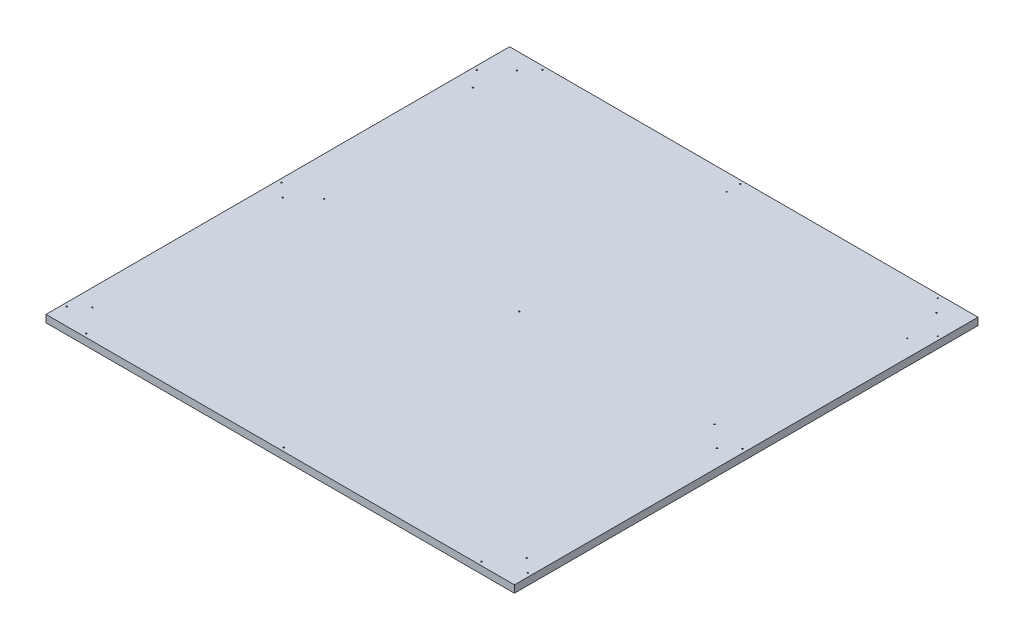
ISO-10303-21;
HEADER;
FILE_DESCRIPTION(('STEP AP214'),'2;1');
FILE_NAME('part.step','',(''),(''),'','','');
FILE_SCHEMA(('AUTOMOTIVE_DESIGN { 1 0 10303 214 1 1 1 1 }'));
ENDSEC;
DATA;
#1=APPLICATION_CONTEXT('core data for automotive mechanical design processes');
#2=APPLICATION_PROTOCOL_DEFINITION('international standard','automotive_design',2000,#1);
#3=PRODUCT_CONTEXT('',#1,'mechanical');
#4=PRODUCT('Part','Part','',(#3));
#5=PRODUCT_RELATED_PRODUCT_CATEGORY('part','',(#4));
#6=PRODUCT_DEFINITION_FORMATION('','',#4);
#7=PRODUCT_DEFINITION_CONTEXT('part definition',#1,'design');
#8=PRODUCT_DEFINITION('design','',#6,#7);
#9=PRODUCT_DEFINITION_SHAPE('','',#8);
#10=(LENGTH_UNIT() NAMED_UNIT(*) SI_UNIT(.MILLI.,.METRE.));
#11=(NAMED_UNIT(*) PLANE_ANGLE_UNIT() SI_UNIT($,.RADIAN.));
#12=(NAMED_UNIT(*) SI_UNIT($,.STERADIAN.) SOLID_ANGLE_UNIT());
#13=UNCERTAINTY_MEASURE_WITH_UNIT(LENGTH_MEASURE(1.E-05),#10,'distance_accuracy_value','');
#14=(GEOMETRIC_REPRESENTATION_CONTEXT(3) GLOBAL_UNCERTAINTY_ASSIGNED_CONTEXT((#13)) GLOBAL_UNIT_ASSIGNED_CONTEXT((#10,
#11,#12)) REPRESENTATION_CONTEXT('',''));
#15=CARTESIAN_POINT('',(0.,0.,0.));
#16=DIRECTION('',(0.,0.,1.));
#17=DIRECTION('',(1.,0.,0.));
#18=AXIS2_PLACEMENT_3D('',#15,#16,#17);
#19=CARTESIAN_POINT('',(0.,19.05,0.));
#20=DIRECTION('',(0.,1.,0.));
#21=DIRECTION('',(0.,0.,1.));
#22=AXIS2_PLACEMENT_3D('',#19,#20,#21);
#23=PLANE('',#22);
#24=CARTESIAN_POINT('',(508.,19.05,-19.05));
#25=DIRECTION('',(0.,1.,0.));
#26=DIRECTION('',(0.,0.,1.));
#27=AXIS2_PLACEMENT_3D('',#24,#25,#26);
#28=CIRCLE('',#27,1.5875);
#29=CARTESIAN_POINT('',(508.,19.05,-17.4625));
#30=VERTEX_POINT('',#29);
#31=EDGE_CURVE('E150',#30,#30,#28,.F.);
#32=ORIENTED_EDGE('',*,*,#31,.T.);
#33=EDGE_LOOP('',(#32));
#34=FACE_BOUND('',#33,.T.);
#35=CARTESIAN_POINT('',(-508.,19.05,-19.05));
#36=DIRECTION('',(0.,1.,0.));
#37=DIRECTION('',(0.,0.,1.));
#38=AXIS2_PLACEMENT_3D('',#35,#36,#37);
#39=CIRCLE('',#38,1.5875);
#40=CARTESIAN_POINT('',(-508.,19.05,-17.4625));
#41=VERTEX_POINT('',#40);
#42=EDGE_CURVE('E153',#41,#41,#39,.F.);
#43=ORIENTED_EDGE('',*,*,#42,.T.);
#44=EDGE_LOOP('',(#43));
#45=FACE_BOUND('',#44,.T.);
#46=CARTESIAN_POINT('',(0.,19.05,-19.05));
#47=DIRECTION('',(0.,1.,0.));
#48=DIRECTION('',(0.,0.,1.));
#49=AXIS2_PLACEMENT_3D('',#46,#47,#48);
#50=CIRCLE('',#49,1.5875);
#51=CARTESIAN_POINT('',(0.,19.05,-17.4625));
#52=VERTEX_POINT('',#51);
#53=EDGE_CURVE('E156',#52,#52,#50,.F.);
#54=ORIENTED_EDGE('',*,*,#53,.T.);
#55=EDGE_LOOP('',(#54));
#56=FACE_BOUND('',#55,.T.);
#57=CARTESIAN_POINT('',(-546.1,19.05,-558.8));
#58=DIRECTION('',(0.,1.,0.));
#59=DIRECTION('',(0.,0.,1.));
#60=AXIS2_PLACEMENT_3D('',#57,#58,#59);
#61=CIRCLE('',#60,1.5875);
#62=CARTESIAN_POINT('',(-546.1,19.05,-557.2125));
#63=VERTEX_POINT('',#62);
#64=EDGE_CURVE('E159',#63,#63,#61,.F.);
#65=ORIENTED_EDGE('',*,*,#64,.T.);
#66=EDGE_LOOP('',(#65));
#67=FACE_BOUND('',#66,.T.);
#68=CARTESIAN_POINT('',(546.1,19.05,-558.8));
#69=DIRECTION('',(0.,1.,0.));
#70=DIRECTION('',(0.,0.,1.));
#71=AXIS2_PLACEMENT_3D('',#68,#69,#70);
#72=CIRCLE('',#71,1.5875);
#73=CARTESIAN_POINT('',(546.1,19.05,-557.2125));
#74=VERTEX_POINT('',#73);
#75=EDGE_CURVE('E162',#74,#74,#72,.F.);
#76=ORIENTED_EDGE('',*,*,#75,.T.);
#77=EDGE_LOOP('',(#76));
#78=FACE_BOUND('',#77,.T.);
#79=CARTESIAN_POINT('',(0.,19.05,-558.8));
#80=DIRECTION('',(0.,1.,0.));
#81=DIRECTION('',(0.,0.,1.));
#82=AXIS2_PLACEMENT_3D('',#79,#80,#81);
#83=CIRCLE('',#82,1.5875);
#84=CARTESIAN_POINT('',(0.,19.05,-557.2125));
#85=VERTEX_POINT('',#84);
#86=EDGE_CURVE('E165',#85,#85,#83,.F.);
#87=ORIENTED_EDGE('',*,*,#86,.T.);
#88=EDGE_LOOP('',(#87));
#89=FACE_BOUND('',#88,.T.);
#90=CARTESIAN_POINT('',(565.15,19.05,-463.55));
#91=DIRECTION('',(0.,1.,0.));
#92=DIRECTION('',(0.,0.,1.));
#93=AXIS2_PLACEMENT_3D('',#90,#91,#92);
#94=CIRCLE('',#93,1.5875);
#95=CARTESIAN_POINT('',(565.15,19.05,-461.9625));
#96=VERTEX_POINT('',#95);
#97=EDGE_CURVE('E168',#96,#96,#94,.F.);
#98=ORIENTED_EDGE('',*,*,#97,.T.);
#99=EDGE_LOOP('',(#98));
#100=FACE_BOUND('',#99,.T.);
#101=CARTESIAN_POINT('',(565.15,19.05,31.75));
#102=DIRECTION('',(0.,1.,0.));
#103=DIRECTION('',(0.,0.,1.));
#104=AXIS2_PLACEMENT_3D('',#101,#102,#103);
#105=CIRCLE('',#104,1.5875);
#106=CARTESIAN_POINT('',(565.15,19.05,33.3375));
#107=VERTEX_POINT('',#106);
#108=EDGE_CURVE('E171',#107,#107,#105,.F.);
#109=ORIENTED_EDGE('',*,*,#108,.T.);
#110=EDGE_LOOP('',(#109));
#111=FACE_BOUND('',#110,.T.);
#112=CARTESIAN_POINT('',(565.15,19.05,527.05));
#113=DIRECTION('',(0.,1.,0.));
#114=DIRECTION('',(0.,0.,1.));
#115=AXIS2_PLACEMENT_3D('',#112,#113,#114);
#116=CIRCLE('',#115,1.5875);
#117=CARTESIAN_POINT('',(565.15,19.05,528.6375));
#118=VERTEX_POINT('',#117);
#119=EDGE_CURVE('E174',#118,#118,#116,.F.);
#120=ORIENTED_EDGE('',*,*,#119,.T.);
#121=EDGE_LOOP('',(#120));
#122=FACE_BOUND('',#121,.T.);
#123=CARTESIAN_POINT('',(-565.15,19.05,31.75));
#124=DIRECTION('',(0.,1.,0.));
#125=DIRECTION('',(0.,0.,1.));
#126=AXIS2_PLACEMENT_3D('',#123,#124,#125);
#127=CIRCLE('',#126,1.5875);
#128=CARTESIAN_POINT('',(-565.15,19.05,33.3375));
#129=VERTEX_POINT('',#128);
#130=EDGE_CURVE('E177',#129,#129,#127,.F.);
#131=ORIENTED_EDGE('',*,*,#130,.T.);
#132=EDGE_LOOP('',(#131));
#133=FACE_BOUND('',#132,.T.);
#134=CARTESIAN_POINT('',(-565.15,19.05,-463.55));
#135=DIRECTION('',(0.,1.,0.));
#136=DIRECTION('',(0.,0.,1.));
#137=AXIS2_PLACEMENT_3D('',#134,#135,#136);
#138=CIRCLE('',#137,1.5875);
#139=CARTESIAN_POINT('',(-565.15,19.05,-461.9625));
#140=VERTEX_POINT('',#139);
#141=EDGE_CURVE('E180',#140,#140,#138,.F.);
#142=ORIENTED_EDGE('',*,*,#141,.T.);
#143=EDGE_LOOP('',(#142));
#144=FACE_BOUND('',#143,.T.);
#145=CARTESIAN_POINT('',(-565.15,19.05,527.05));
#146=DIRECTION('',(0.,1.,0.));
#147=DIRECTION('',(0.,0.,1.));
#148=AXIS2_PLACEMENT_3D('',#145,#146,#147);
#149=CIRCLE('',#148,1.5875);
#150=CARTESIAN_POINT('',(-565.15,19.05,528.6375));
#151=VERTEX_POINT('',#150);
#152=EDGE_CURVE('E183',#151,#151,#149,.F.);
#153=ORIENTED_EDGE('',*,*,#152,.T.);
#154=EDGE_LOOP('',(#153));
#155=FACE_BOUND('',#154,.T.);
#156=CARTESIAN_POINT('',(-514.35,19.05,-593.725));
#157=DIRECTION('',(0.,-1.,0.));
#158=DIRECTION('',(0.,0.,-1.));
#159=AXIS2_PLACEMENT_3D('',#156,#157,#158);
#160=CIRCLE('',#159,1.5875);
#161=CARTESIAN_POINT('',(-514.35,19.05,-595.3125));
#162=VERTEX_POINT('',#161);
#163=EDGE_CURVE('E186',#162,#162,#160,.T.);
#164=ORIENTED_EDGE('',*,*,#163,.T.);
#165=EDGE_LOOP('',(#164));
#166=FACE_BOUND('',#165,.T.);
#167=CARTESIAN_POINT('',(514.35,19.05,-593.725));
#168=DIRECTION('',(0.,-1.,0.));
#169=DIRECTION('',(0.,0.,-1.));
#170=AXIS2_PLACEMENT_3D('',#167,#168,#169);
#171=CIRCLE('',#170,1.5875);
#172=CARTESIAN_POINT('',(514.35,19.05,-595.3125));
#173=VERTEX_POINT('',#172);
#174=EDGE_CURVE('E189',#173,#173,#171,.T.);
#175=ORIENTED_EDGE('',*,*,#174,.T.);
#176=EDGE_LOOP('',(#175));
#177=FACE_BOUND('',#176,.T.);
#178=CARTESIAN_POINT('',(-514.35,19.05,593.725));
#179=DIRECTION('',(0.,-1.,0.));
#180=DIRECTION('',(0.,0.,-1.));
#181=AXIS2_PLACEMENT_3D('',#178,#179,#180);
#182=CIRCLE('',#181,1.5875);
#183=CARTESIAN_POINT('',(-514.35,19.05,592.1375));
#184=VERTEX_POINT('',#183);
#185=EDGE_CURVE('E192',#184,#184,#182,.T.);
#186=ORIENTED_EDGE('',*,*,#185,.T.);
#187=EDGE_LOOP('',(#186));
#188=FACE_BOUND('',#187,.T.);
#189=CARTESIAN_POINT('',(514.35,19.05,593.725));
#190=DIRECTION('',(0.,-1.,0.));
#191=DIRECTION('',(0.,0.,-1.));
#192=AXIS2_PLACEMENT_3D('',#189,#190,#191);
#193=CIRCLE('',#192,1.5875);
#194=CARTESIAN_POINT('',(514.35,19.05,592.1375));
#195=VERTEX_POINT('',#194);
#196=EDGE_CURVE('E195',#195,#195,#193,.T.);
#197=ORIENTED_EDGE('',*,*,#196,.T.);
#198=EDGE_LOOP('',(#197));
#199=FACE_BOUND('',#198,.T.);
#200=CARTESIAN_POINT('',(-600.075,19.05,558.8));
#201=DIRECTION('',(0.,-1.,0.));
#202=DIRECTION('',(0.,0.,-1.));
#203=AXIS2_PLACEMENT_3D('',#200,#201,#202);
#204=CIRCLE('',#203,1.5875);
#205=CARTESIAN_POINT('',(-600.075,19.05,557.2125));
#206=VERTEX_POINT('',#205);
#207=EDGE_CURVE('E198',#206,#206,#204,.T.);
#208=ORIENTED_EDGE('',*,*,#207,.T.);
#209=EDGE_LOOP('',(#208));
#210=FACE_BOUND('',#209,.T.);
#211=CARTESIAN_POINT('',(600.075,19.05,558.8));
#212=DIRECTION('',(0.,-1.,0.));
#213=DIRECTION('',(0.,0.,-1.));
#214=AXIS2_PLACEMENT_3D('',#211,#212,#213);
#215=CIRCLE('',#214,1.5875);
#216=CARTESIAN_POINT('',(600.075,19.05,557.2125));
#217=VERTEX_POINT('',#216);
#218=EDGE_CURVE('E201',#217,#217,#215,.T.);
#219=ORIENTED_EDGE('',*,*,#218,.T.);
#220=EDGE_LOOP('',(#219));
#221=FACE_BOUND('',#220,.T.);
#222=CARTESIAN_POINT('',(600.075,19.05,-508.));
#223=DIRECTION('',(0.,-1.,0.));
#224=DIRECTION('',(0.,0.,-1.));
#225=AXIS2_PLACEMENT_3D('',#222,#223,#224);
#226=CIRCLE('',#225,1.5875);
#227=CARTESIAN_POINT('',(600.075,19.05,-509.5875));
#228=VERTEX_POINT('',#227);
#229=EDGE_CURVE('E204',#228,#228,#226,.T.);
#230=ORIENTED_EDGE('',*,*,#229,.T.);
#231=EDGE_LOOP('',(#230));
#232=FACE_BOUND('',#231,.T.);
#233=CARTESIAN_POINT('',(-600.075,19.05,-508.));
#234=DIRECTION('',(0.,-1.,0.));
#235=DIRECTION('',(0.,0.,-1.));
#236=AXIS2_PLACEMENT_3D('',#233,#234,#235);
#237=CIRCLE('',#236,1.5875);
#238=CARTESIAN_POINT('',(-600.075,19.05,-509.5875));
#239=VERTEX_POINT('',#238);
#240=EDGE_CURVE('E207',#239,#239,#237,.T.);
#241=ORIENTED_EDGE('',*,*,#240,.T.);
#242=EDGE_LOOP('',(#241));
#243=FACE_BOUND('',#242,.T.);
#244=CARTESIAN_POINT('',(0.,19.05,593.725));
#245=DIRECTION('',(0.,-1.,0.));
#246=DIRECTION('',(0.,0.,-1.));
#247=AXIS2_PLACEMENT_3D('',#244,#245,#246);
#248=CIRCLE('',#247,1.5875);
#249=CARTESIAN_POINT('',(0.,19.05,592.1375));
#250=VERTEX_POINT('',#249);
#251=EDGE_CURVE('E210',#250,#250,#248,.T.);
#252=ORIENTED_EDGE('',*,*,#251,.T.);
#253=EDGE_LOOP('',(#252));
#254=FACE_BOUND('',#253,.T.);
#255=CARTESIAN_POINT('',(0.,19.05,-593.725));
#256=DIRECTION('',(0.,-1.,0.));
#257=DIRECTION('',(0.,0.,-1.));
#258=AXIS2_PLACEMENT_3D('',#255,#256,#257);
#259=CIRCLE('',#258,1.5875);
#260=CARTESIAN_POINT('',(0.,19.05,-595.3125));
#261=VERTEX_POINT('',#260);
#262=EDGE_CURVE('E213',#261,#261,#259,.T.);
#263=ORIENTED_EDGE('',*,*,#262,.T.);
#264=EDGE_LOOP('',(#263));
#265=FACE_BOUND('',#264,.T.);
#266=CARTESIAN_POINT('',(600.075,19.05,0.));
#267=DIRECTION('',(0.,-1.,0.));
#268=DIRECTION('',(0.,0.,-1.));
#269=AXIS2_PLACEMENT_3D('',#266,#267,#268);
#270=CIRCLE('',#269,1.5875);
#271=CARTESIAN_POINT('',(600.075,19.05,-1.5875));
#272=VERTEX_POINT('',#271);
#273=EDGE_CURVE('E215',#272,#272,#270,.T.);
#274=ORIENTED_EDGE('',*,*,#273,.T.);
#275=EDGE_LOOP('',(#274));
#276=FACE_BOUND('',#275,.T.);
#277=CARTESIAN_POINT('',(-600.075,19.05,0.));
#278=DIRECTION('',(0.,-1.,0.));
#279=DIRECTION('',(0.,0.,-1.));
#280=AXIS2_PLACEMENT_3D('',#277,#278,#279);
#281=CIRCLE('',#280,1.5875);
#282=CARTESIAN_POINT('',(-600.075,19.05,-1.5875));
#283=VERTEX_POINT('',#282);
#284=EDGE_CURVE('E18',#283,#283,#281,.T.);
#285=ORIENTED_EDGE('',*,*,#284,.T.);
#286=EDGE_LOOP('',(#285));
#287=FACE_BOUND('',#286,.T.);
#288=DIRECTION('',(0.,0.,-1.));
#289=VECTOR('',#288,1.);
#290=CARTESIAN_POINT('',(609.6,19.05,603.25));
#291=LINE('',#290,#289);
#292=CARTESIAN_POINT('',(609.6,19.05,-603.25));
#293=VERTEX_POINT('',#292);
#294=CARTESIAN_POINT('',(609.6,19.05,603.25));
#295=VERTEX_POINT('',#294);
#296=EDGE_CURVE('E69',#293,#295,#291,.F.);
#297=ORIENTED_EDGE('',*,*,#296,.F.);
#298=DIRECTION('',(-1.,0.,0.));
#299=VECTOR('',#298,1.);
#300=CARTESIAN_POINT('',(609.6,19.05,-603.25));
#301=LINE('',#300,#299);
#302=CARTESIAN_POINT('',(-609.6,19.05,-603.25));
#303=VERTEX_POINT('',#302);
#304=EDGE_CURVE('E66',#303,#293,#301,.F.);
#305=ORIENTED_EDGE('',*,*,#304,.F.);
#306=DIRECTION('',(0.,0.,1.));
#307=VECTOR('',#306,1.);
#308=CARTESIAN_POINT('',(-609.6,19.05,-603.25));
#309=LINE('',#308,#307);
#310=CARTESIAN_POINT('',(-609.6,19.05,603.25));
#311=VERTEX_POINT('',#310);
#312=EDGE_CURVE('E57',#311,#303,#309,.F.);
#313=ORIENTED_EDGE('',*,*,#312,.F.);
#314=DIRECTION('',(1.,0.,0.));
#315=VECTOR('',#314,1.);
#316=CARTESIAN_POINT('',(-609.6,19.05,603.25));
#317=LINE('',#316,#315);
#318=EDGE_CURVE('E52',#295,#311,#317,.F.);
#319=ORIENTED_EDGE('',*,*,#318,.F.);
#320=EDGE_LOOP('',(#297,#305,#313,#319));
#321=FACE_BOUND('',#320,.T.);
#322=ADVANCED_FACE('F15',(#34,#45,#56,#67,#78,#89,#100,#111,#122,#133,#144,#155,#166,#177,#188,
#199,#210,#221,#232,#243,#254,#265,#276,#287,#321),#23,.T.);
#323=CARTESIAN_POINT('',(609.6,0.,-603.25));
#324=DIRECTION('',(0.,0.,-1.));
#325=DIRECTION('',(-1.,0.,0.));
#326=AXIS2_PLACEMENT_3D('',#323,#324,#325);
#327=PLANE('',#326);
#328=DIRECTION('',(0.,1.,0.));
#329=VECTOR('',#328,1.);
#330=CARTESIAN_POINT('',(609.6,0.,-603.25));
#331=LINE('',#330,#329);
#332=CARTESIAN_POINT('',(609.6,0.,-603.25));
#333=VERTEX_POINT('',#332);
#334=EDGE_CURVE('E223',#333,#293,#331,.T.);
#335=ORIENTED_EDGE('',*,*,#334,.F.);
#336=DIRECTION('',(1.,0.,0.));
#337=VECTOR('',#336,1.);
#338=CARTESIAN_POINT('',(0.,0.,-603.25));
#339=LINE('',#338,#337);
#340=CARTESIAN_POINT('',(-609.6,0.,-603.25));
#341=VERTEX_POINT('',#340);
#342=EDGE_CURVE('E76',#333,#341,#339,.F.);
#343=ORIENTED_EDGE('',*,*,#342,.T.);
#344=DIRECTION('',(0.,1.,0.));
#345=VECTOR('',#344,1.);
#346=CARTESIAN_POINT('',(-609.6,0.,-603.25));
#347=LINE('',#346,#345);
#348=EDGE_CURVE('E62',#303,#341,#347,.F.);
#349=ORIENTED_EDGE('',*,*,#348,.F.);
#350=ORIENTED_EDGE('',*,*,#304,.T.);
#351=EDGE_LOOP('',(#335,#343,#349,#350));
#352=FACE_BOUND('',#351,.T.);
#353=ADVANCED_FACE('F75',(#352),#327,.T.);
#354=CARTESIAN_POINT('',(-609.6,0.,-603.25));
#355=DIRECTION('',(-1.,0.,0.));
#356=DIRECTION('',(0.,0.,1.));
#357=AXIS2_PLACEMENT_3D('',#354,#355,#356);
#358=PLANE('',#357);
#359=ORIENTED_EDGE('',*,*,#348,.T.);
#360=DIRECTION('',(0.,0.,1.));
#361=VECTOR('',#360,1.);
#362=CARTESIAN_POINT('',(-609.6,0.,0.));
#363=LINE('',#362,#361);
#364=CARTESIAN_POINT('',(-609.6,0.,603.25));
#365=VERTEX_POINT('',#364);
#366=EDGE_CURVE('E234',#341,#365,#363,.T.);
#367=ORIENTED_EDGE('',*,*,#366,.T.);
#368=DIRECTION('',(0.,1.,0.));
#369=VECTOR('',#368,1.);
#370=CARTESIAN_POINT('',(-609.6,0.,603.25));
#371=LINE('',#370,#369);
#372=EDGE_CURVE('E64',#311,#365,#371,.F.);
#373=ORIENTED_EDGE('',*,*,#372,.F.);
#374=ORIENTED_EDGE('',*,*,#312,.T.);
#375=EDGE_LOOP('',(#359,#367,#373,#374));
#376=FACE_BOUND('',#375,.T.);
#377=ADVANCED_FACE('F59',(#376),#358,.T.);
#378=CARTESIAN_POINT('',(-609.6,0.,603.25));
#379=DIRECTION('',(0.,0.,1.));
#380=DIRECTION('',(1.,0.,0.));
#381=AXIS2_PLACEMENT_3D('',#378,#379,#380);
#382=PLANE('',#381);
#383=ORIENTED_EDGE('',*,*,#372,.T.);
#384=DIRECTION('',(1.,0.,0.));
#385=VECTOR('',#384,1.);
#386=CARTESIAN_POINT('',(0.,0.,603.25));
#387=LINE('',#386,#385);
#388=CARTESIAN_POINT('',(609.6,0.,603.25));
#389=VERTEX_POINT('',#388);
#390=EDGE_CURVE('E231',#365,#389,#387,.T.);
#391=ORIENTED_EDGE('',*,*,#390,.T.);
#392=DIRECTION('',(0.,1.,0.));
#393=VECTOR('',#392,1.);
#394=CARTESIAN_POINT('',(609.6,0.,603.25));
#395=LINE('',#394,#393);
#396=EDGE_CURVE('E33',#295,#389,#395,.F.);
#397=ORIENTED_EDGE('',*,*,#396,.F.);
#398=ORIENTED_EDGE('',*,*,#318,.T.);
#399=EDGE_LOOP('',(#383,#391,#397,#398));
#400=FACE_BOUND('',#399,.T.);
#401=ADVANCED_FACE('F230',(#400),#382,.T.);
#402=CARTESIAN_POINT('',(609.6,0.,603.25));
#403=DIRECTION('',(1.,0.,0.));
#404=DIRECTION('',(0.,0.,-1.));
#405=AXIS2_PLACEMENT_3D('',#402,#403,#404);
#406=PLANE('',#405);
#407=ORIENTED_EDGE('',*,*,#396,.T.);
#408=DIRECTION('',(0.,0.,1.));
#409=VECTOR('',#408,1.);
#410=CARTESIAN_POINT('',(609.6,0.,0.));
#411=LINE('',#410,#409);
#412=EDGE_CURVE('E149',#389,#333,#411,.F.);
#413=ORIENTED_EDGE('',*,*,#412,.T.);
#414=ORIENTED_EDGE('',*,*,#334,.T.);
#415=ORIENTED_EDGE('',*,*,#296,.T.);
#416=EDGE_LOOP('',(#407,#413,#414,#415));
#417=FACE_BOUND('',#416,.T.);
#418=ADVANCED_FACE('F237',(#417),#406,.T.);
#419=CARTESIAN_POINT('',(-600.075,0.,0.));
#420=DIRECTION('',(0.,-1.,0.));
#421=DIRECTION('',(0.,0.,-1.));
#422=AXIS2_PLACEMENT_3D('',#419,#420,#421);
#423=CYLINDRICAL_SURFACE('',#422,1.5875);
#424=ORIENTED_EDGE('',*,*,#284,.F.);
#425=EDGE_LOOP('',(#424));
#426=FACE_BOUND('',#425,.T.);
#427=CARTESIAN_POINT('',(-600.075,0.,0.));
#428=DIRECTION('',(0.,-1.,0.));
#429=DIRECTION('',(0.,0.,-1.));
#430=AXIS2_PLACEMENT_3D('',#427,#428,#429);
#431=CIRCLE('',#430,1.5875);
#432=CARTESIAN_POINT('',(-600.075,0.,-1.5875));
#433=VERTEX_POINT('',#432);
#434=EDGE_CURVE('E146',#433,#433,#431,.T.);
#435=ORIENTED_EDGE('',*,*,#434,.T.);
#436=EDGE_LOOP('',(#435));
#437=FACE_BOUND('',#436,.T.);
#438=ADVANCED_FACE('F239',(#426,#437),#423,.F.);
#439=CARTESIAN_POINT('',(600.075,0.,0.));
#440=DIRECTION('',(0.,-1.,0.));
#441=DIRECTION('',(0.,0.,-1.));
#442=AXIS2_PLACEMENT_3D('',#439,#440,#441);
#443=CYLINDRICAL_SURFACE('',#442,1.5875);
#444=ORIENTED_EDGE('',*,*,#273,.F.);
#445=EDGE_LOOP('',(#444));
#446=FACE_BOUND('',#445,.T.);
#447=CARTESIAN_POINT('',(600.075,0.,0.));
#448=DIRECTION('',(0.,-1.,0.));
#449=DIRECTION('',(0.,0.,-1.));
#450=AXIS2_PLACEMENT_3D('',#447,#448,#449);
#451=CIRCLE('',#450,1.5875);
#452=CARTESIAN_POINT('',(600.075,0.,-1.5875));
#453=VERTEX_POINT('',#452);
#454=EDGE_CURVE('E143',#453,#453,#451,.T.);
#455=ORIENTED_EDGE('',*,*,#454,.T.);
#456=EDGE_LOOP('',(#455));
#457=FACE_BOUND('',#456,.T.);
#458=ADVANCED_FACE('F246',(#446,#457),#443,.F.);
#459=CARTESIAN_POINT('',(0.,0.,-593.725));
#460=DIRECTION('',(0.,-1.,0.));
#461=DIRECTION('',(0.,0.,-1.));
#462=AXIS2_PLACEMENT_3D('',#459,#460,#461);
#463=CYLINDRICAL_SURFACE('',#462,1.5875);
#464=ORIENTED_EDGE('',*,*,#262,.F.);
#465=EDGE_LOOP('',(#464));
#466=FACE_BOUND('',#465,.T.);
#467=CARTESIAN_POINT('',(0.,0.,-593.725));
#468=DIRECTION('',(0.,-1.,0.));
#469=DIRECTION('',(0.,0.,-1.));
#470=AXIS2_PLACEMENT_3D('',#467,#468,#469);
#471=CIRCLE('',#470,1.5875);
#472=CARTESIAN_POINT('',(0.,0.,-595.3125));
#473=VERTEX_POINT('',#472);
#474=EDGE_CURVE('E140',#473,#473,#471,.T.);
#475=ORIENTED_EDGE('',*,*,#474,.T.);
#476=EDGE_LOOP('',(#475));
#477=FACE_BOUND('',#476,.T.);
#478=ADVANCED_FACE('F341',(#466,#477),#463,.F.);
#479=CARTESIAN_POINT('',(0.,0.,593.725));
#480=DIRECTION('',(0.,-1.,0.));
#481=DIRECTION('',(0.,0.,-1.));
#482=AXIS2_PLACEMENT_3D('',#479,#480,#481);
#483=CYLINDRICAL_SURFACE('',#482,1.5875);
#484=ORIENTED_EDGE('',*,*,#251,.F.);
#485=EDGE_LOOP('',(#484));
#486=FACE_BOUND('',#485,.T.);
#487=CARTESIAN_POINT('',(0.,0.,593.725));
#488=DIRECTION('',(0.,-1.,0.));
#489=DIRECTION('',(0.,0.,-1.));
#490=AXIS2_PLACEMENT_3D('',#487,#488,#489);
#491=CIRCLE('',#490,1.5875);
#492=CARTESIAN_POINT('',(0.,0.,592.1375));
#493=VERTEX_POINT('',#492);
#494=EDGE_CURVE('E137',#493,#493,#491,.T.);
#495=ORIENTED_EDGE('',*,*,#494,.T.);
#496=EDGE_LOOP('',(#495));
#497=FACE_BOUND('',#496,.T.);
#498=ADVANCED_FACE('F337',(#486,#497),#483,.F.);
#499=CARTESIAN_POINT('',(-600.075,0.,-508.));
#500=DIRECTION('',(0.,-1.,0.));
#501=DIRECTION('',(0.,0.,-1.));
#502=AXIS2_PLACEMENT_3D('',#499,#500,#501);
#503=CYLINDRICAL_SURFACE('',#502,1.5875);
#504=ORIENTED_EDGE('',*,*,#240,.F.);
#505=EDGE_LOOP('',(#504));
#506=FACE_BOUND('',#505,.T.);
#507=CARTESIAN_POINT('',(-600.075,0.,-508.));
#508=DIRECTION('',(0.,-1.,0.));
#509=DIRECTION('',(0.,0.,-1.));
#510=AXIS2_PLACEMENT_3D('',#507,#508,#509);
#511=CIRCLE('',#510,1.5875);
#512=CARTESIAN_POINT('',(-600.075,0.,-509.5875));
#513=VERTEX_POINT('',#512);
#514=EDGE_CURVE('E134',#513,#513,#511,.T.);
#515=ORIENTED_EDGE('',*,*,#514,.T.);
#516=EDGE_LOOP('',(#515));
#517=FACE_BOUND('',#516,.T.);
#518=ADVANCED_FACE('F333',(#506,#517),#503,.F.);
#519=CARTESIAN_POINT('',(600.075,0.,-508.));
#520=DIRECTION('',(0.,-1.,0.));
#521=DIRECTION('',(0.,0.,-1.));
#522=AXIS2_PLACEMENT_3D('',#519,#520,#521);
#523=CYLINDRICAL_SURFACE('',#522,1.5875);
#524=ORIENTED_EDGE('',*,*,#229,.F.);
#525=EDGE_LOOP('',(#524));
#526=FACE_BOUND('',#525,.T.);
#527=CARTESIAN_POINT('',(600.075,0.,-508.));
#528=DIRECTION('',(0.,-1.,0.));
#529=DIRECTION('',(0.,0.,-1.));
#530=AXIS2_PLACEMENT_3D('',#527,#528,#529);
#531=CIRCLE('',#530,1.5875);
#532=CARTESIAN_POINT('',(600.075,0.,-509.5875));
#533=VERTEX_POINT('',#532);
#534=EDGE_CURVE('E131',#533,#533,#531,.T.);
#535=ORIENTED_EDGE('',*,*,#534,.T.);
#536=EDGE_LOOP('',(#535));
#537=FACE_BOUND('',#536,.T.);
#538=ADVANCED_FACE('F329',(#526,#537),#523,.F.);
#539=CARTESIAN_POINT('',(600.075,0.,558.8));
#540=DIRECTION('',(0.,-1.,0.));
#541=DIRECTION('',(0.,0.,-1.));
#542=AXIS2_PLACEMENT_3D('',#539,#540,#541);
#543=CYLINDRICAL_SURFACE('',#542,1.5875);
#544=ORIENTED_EDGE('',*,*,#218,.F.);
#545=EDGE_LOOP('',(#544));
#546=FACE_BOUND('',#545,.T.);
#547=CARTESIAN_POINT('',(600.075,0.,558.8));
#548=DIRECTION('',(0.,-1.,0.));
#549=DIRECTION('',(0.,0.,-1.));
#550=AXIS2_PLACEMENT_3D('',#547,#548,#549);
#551=CIRCLE('',#550,1.5875);
#552=CARTESIAN_POINT('',(600.075,0.,557.2125));
#553=VERTEX_POINT('',#552);
#554=EDGE_CURVE('E128',#553,#553,#551,.T.);
#555=ORIENTED_EDGE('',*,*,#554,.T.);
#556=EDGE_LOOP('',(#555));
#557=FACE_BOUND('',#556,.T.);
#558=ADVANCED_FACE('F325',(#546,#557),#543,.F.);
#559=CARTESIAN_POINT('',(-600.075,0.,558.8));
#560=DIRECTION('',(0.,-1.,0.));
#561=DIRECTION('',(0.,0.,-1.));
#562=AXIS2_PLACEMENT_3D('',#559,#560,#561);
#563=CYLINDRICAL_SURFACE('',#562,1.5875);
#564=ORIENTED_EDGE('',*,*,#207,.F.);
#565=EDGE_LOOP('',(#564));
#566=FACE_BOUND('',#565,.T.);
#567=CARTESIAN_POINT('',(-600.075,0.,558.8));
#568=DIRECTION('',(0.,-1.,0.));
#569=DIRECTION('',(0.,0.,-1.));
#570=AXIS2_PLACEMENT_3D('',#567,#568,#569);
#571=CIRCLE('',#570,1.5875);
#572=CARTESIAN_POINT('',(-600.075,0.,557.2125));
#573=VERTEX_POINT('',#572);
#574=EDGE_CURVE('E125',#573,#573,#571,.T.);
#575=ORIENTED_EDGE('',*,*,#574,.T.);
#576=EDGE_LOOP('',(#575));
#577=FACE_BOUND('',#576,.T.);
#578=ADVANCED_FACE('F321',(#566,#577),#563,.F.);
#579=CARTESIAN_POINT('',(514.35,0.,593.725));
#580=DIRECTION('',(0.,-1.,0.));
#581=DIRECTION('',(0.,0.,-1.));
#582=AXIS2_PLACEMENT_3D('',#579,#580,#581);
#583=CYLINDRICAL_SURFACE('',#582,1.5875);
#584=ORIENTED_EDGE('',*,*,#196,.F.);
#585=EDGE_LOOP('',(#584));
#586=FACE_BOUND('',#585,.T.);
#587=CARTESIAN_POINT('',(514.35,0.,593.725));
#588=DIRECTION('',(0.,-1.,0.));
#589=DIRECTION('',(0.,0.,-1.));
#590=AXIS2_PLACEMENT_3D('',#587,#588,#589);
#591=CIRCLE('',#590,1.5875);
#592=CARTESIAN_POINT('',(514.35,0.,592.1375));
#593=VERTEX_POINT('',#592);
#594=EDGE_CURVE('E122',#593,#593,#591,.T.);
#595=ORIENTED_EDGE('',*,*,#594,.T.);
#596=EDGE_LOOP('',(#595));
#597=FACE_BOUND('',#596,.T.);
#598=ADVANCED_FACE('F317',(#586,#597),#583,.F.);
#599=CARTESIAN_POINT('',(-514.35,0.,593.725));
#600=DIRECTION('',(0.,-1.,0.));
#601=DIRECTION('',(0.,0.,-1.));
#602=AXIS2_PLACEMENT_3D('',#599,#600,#601);
#603=CYLINDRICAL_SURFACE('',#602,1.5875);
#604=ORIENTED_EDGE('',*,*,#185,.F.);
#605=EDGE_LOOP('',(#604));
#606=FACE_BOUND('',#605,.T.);
#607=CARTESIAN_POINT('',(-514.35,0.,593.725));
#608=DIRECTION('',(0.,-1.,0.));
#609=DIRECTION('',(0.,0.,-1.));
#610=AXIS2_PLACEMENT_3D('',#607,#608,#609);
#611=CIRCLE('',#610,1.5875);
#612=CARTESIAN_POINT('',(-514.35,0.,592.1375));
#613=VERTEX_POINT('',#612);
#614=EDGE_CURVE('E119',#613,#613,#611,.T.);
#615=ORIENTED_EDGE('',*,*,#614,.T.);
#616=EDGE_LOOP('',(#615));
#617=FACE_BOUND('',#616,.T.);
#618=ADVANCED_FACE('F313',(#606,#617),#603,.F.);
#619=CARTESIAN_POINT('',(514.35,0.,-593.725));
#620=DIRECTION('',(0.,-1.,0.));
#621=DIRECTION('',(0.,0.,-1.));
#622=AXIS2_PLACEMENT_3D('',#619,#620,#621);
#623=CYLINDRICAL_SURFACE('',#622,1.5875);
#624=ORIENTED_EDGE('',*,*,#174,.F.);
#625=EDGE_LOOP('',(#624));
#626=FACE_BOUND('',#625,.T.);
#627=CARTESIAN_POINT('',(514.35,0.,-593.725));
#628=DIRECTION('',(0.,-1.,0.));
#629=DIRECTION('',(0.,0.,-1.));
#630=AXIS2_PLACEMENT_3D('',#627,#628,#629);
#631=CIRCLE('',#630,1.5875);
#632=CARTESIAN_POINT('',(514.35,0.,-595.3125));
#633=VERTEX_POINT('',#632);
#634=EDGE_CURVE('E116',#633,#633,#631,.T.);
#635=ORIENTED_EDGE('',*,*,#634,.T.);
#636=EDGE_LOOP('',(#635));
#637=FACE_BOUND('',#636,.T.);
#638=ADVANCED_FACE('F309',(#626,#637),#623,.F.);
#639=CARTESIAN_POINT('',(-514.35,0.,-593.725));
#640=DIRECTION('',(0.,-1.,0.));
#641=DIRECTION('',(0.,0.,-1.));
#642=AXIS2_PLACEMENT_3D('',#639,#640,#641);
#643=CYLINDRICAL_SURFACE('',#642,1.5875);
#644=ORIENTED_EDGE('',*,*,#163,.F.);
#645=EDGE_LOOP('',(#644));
#646=FACE_BOUND('',#645,.T.);
#647=CARTESIAN_POINT('',(-514.35,0.,-593.725));
#648=DIRECTION('',(0.,-1.,0.));
#649=DIRECTION('',(0.,0.,-1.));
#650=AXIS2_PLACEMENT_3D('',#647,#648,#649);
#651=CIRCLE('',#650,1.5875);
#652=CARTESIAN_POINT('',(-514.35,0.,-595.3125));
#653=VERTEX_POINT('',#652);
#654=EDGE_CURVE('E113',#653,#653,#651,.T.);
#655=ORIENTED_EDGE('',*,*,#654,.T.);
#656=EDGE_LOOP('',(#655));
#657=FACE_BOUND('',#656,.T.);
#658=ADVANCED_FACE('F305',(#646,#657),#643,.F.);
#659=CARTESIAN_POINT('',(-565.15,19.05,527.05));
#660=DIRECTION('',(0.,1.,0.));
#661=DIRECTION('',(0.,0.,1.));
#662=AXIS2_PLACEMENT_3D('',#659,#660,#661);
#663=CYLINDRICAL_SURFACE('',#662,1.5875);
#664=ORIENTED_EDGE('',*,*,#152,.F.);
#665=EDGE_LOOP('',(#664));
#666=FACE_BOUND('',#665,.T.);
#667=CARTESIAN_POINT('',(-565.15,0.,527.05));
#668=DIRECTION('',(0.,1.,0.));
#669=DIRECTION('',(0.,0.,1.));
#670=AXIS2_PLACEMENT_3D('',#667,#668,#669);
#671=CIRCLE('',#670,1.5875);
#672=CARTESIAN_POINT('',(-565.15,0.,528.6375));
#673=VERTEX_POINT('',#672);
#674=EDGE_CURVE('E110',#673,#673,#671,.F.);
#675=ORIENTED_EDGE('',*,*,#674,.T.);
#676=EDGE_LOOP('',(#675));
#677=FACE_BOUND('',#676,.T.);
#678=ADVANCED_FACE('F301',(#666,#677),#663,.F.);
#679=CARTESIAN_POINT('',(-565.15,19.05,-463.55));
#680=DIRECTION('',(0.,1.,0.));
#681=DIRECTION('',(0.,0.,1.));
#682=AXIS2_PLACEMENT_3D('',#679,#680,#681);
#683=CYLINDRICAL_SURFACE('',#682,1.5875);
#684=ORIENTED_EDGE('',*,*,#141,.F.);
#685=EDGE_LOOP('',(#684));
#686=FACE_BOUND('',#685,.T.);
#687=CARTESIAN_POINT('',(-565.15,0.,-463.55));
#688=DIRECTION('',(0.,1.,0.));
#689=DIRECTION('',(0.,0.,1.));
#690=AXIS2_PLACEMENT_3D('',#687,#688,#689);
#691=CIRCLE('',#690,1.5875);
#692=CARTESIAN_POINT('',(-565.15,0.,-461.9625));
#693=VERTEX_POINT('',#692);
#694=EDGE_CURVE('E107',#693,#693,#691,.F.);
#695=ORIENTED_EDGE('',*,*,#694,.T.);
#696=EDGE_LOOP('',(#695));
#697=FACE_BOUND('',#696,.T.);
#698=ADVANCED_FACE('F297',(#686,#697),#683,.F.);
#699=CARTESIAN_POINT('',(-565.15,19.05,31.75));
#700=DIRECTION('',(0.,1.,0.));
#701=DIRECTION('',(0.,0.,1.));
#702=AXIS2_PLACEMENT_3D('',#699,#700,#701);
#703=CYLINDRICAL_SURFACE('',#702,1.5875);
#704=ORIENTED_EDGE('',*,*,#130,.F.);
#705=EDGE_LOOP('',(#704));
#706=FACE_BOUND('',#705,.T.);
#707=CARTESIAN_POINT('',(-565.15,0.,31.75));
#708=DIRECTION('',(0.,1.,0.));
#709=DIRECTION('',(0.,0.,1.));
#710=AXIS2_PLACEMENT_3D('',#707,#708,#709);
#711=CIRCLE('',#710,1.5875);
#712=CARTESIAN_POINT('',(-565.15,0.,33.3375));
#713=VERTEX_POINT('',#712);
#714=EDGE_CURVE('E104',#713,#713,#711,.F.);
#715=ORIENTED_EDGE('',*,*,#714,.T.);
#716=EDGE_LOOP('',(#715));
#717=FACE_BOUND('',#716,.T.);
#718=ADVANCED_FACE('F293',(#706,#717),#703,.F.);
#719=CARTESIAN_POINT('',(565.15,19.05,527.05));
#720=DIRECTION('',(0.,1.,0.));
#721=DIRECTION('',(0.,0.,1.));
#722=AXIS2_PLACEMENT_3D('',#719,#720,#721);
#723=CYLINDRICAL_SURFACE('',#722,1.5875);
#724=ORIENTED_EDGE('',*,*,#119,.F.);
#725=EDGE_LOOP('',(#724));
#726=FACE_BOUND('',#725,.T.);
#727=CARTESIAN_POINT('',(565.15,0.,527.05));
#728=DIRECTION('',(0.,1.,0.));
#729=DIRECTION('',(0.,0.,1.));
#730=AXIS2_PLACEMENT_3D('',#727,#728,#729);
#731=CIRCLE('',#730,1.5875);
#732=CARTESIAN_POINT('',(565.15,0.,528.6375));
#733=VERTEX_POINT('',#732);
#734=EDGE_CURVE('E101',#733,#733,#731,.F.);
#735=ORIENTED_EDGE('',*,*,#734,.T.);
#736=EDGE_LOOP('',(#735));
#737=FACE_BOUND('',#736,.T.);
#738=ADVANCED_FACE('F289',(#726,#737),#723,.F.);
#739=CARTESIAN_POINT('',(565.15,19.05,31.75));
#740=DIRECTION('',(0.,1.,0.));
#741=DIRECTION('',(0.,0.,1.));
#742=AXIS2_PLACEMENT_3D('',#739,#740,#741);
#743=CYLINDRICAL_SURFACE('',#742,1.5875);
#744=ORIENTED_EDGE('',*,*,#108,.F.);
#745=EDGE_LOOP('',(#744));
#746=FACE_BOUND('',#745,.T.);
#747=CARTESIAN_POINT('',(565.15,0.,31.75));
#748=DIRECTION('',(0.,1.,0.));
#749=DIRECTION('',(0.,0.,1.));
#750=AXIS2_PLACEMENT_3D('',#747,#748,#749);
#751=CIRCLE('',#750,1.5875);
#752=CARTESIAN_POINT('',(565.15,0.,33.3375));
#753=VERTEX_POINT('',#752);
#754=EDGE_CURVE('E98',#753,#753,#751,.F.);
#755=ORIENTED_EDGE('',*,*,#754,.T.);
#756=EDGE_LOOP('',(#755));
#757=FACE_BOUND('',#756,.T.);
#758=ADVANCED_FACE('F285',(#746,#757),#743,.F.);
#759=CARTESIAN_POINT('',(565.15,19.05,-463.55));
#760=DIRECTION('',(0.,1.,0.));
#761=DIRECTION('',(0.,0.,1.));
#762=AXIS2_PLACEMENT_3D('',#759,#760,#761);
#763=CYLINDRICAL_SURFACE('',#762,1.5875);
#764=ORIENTED_EDGE('',*,*,#97,.F.);
#765=EDGE_LOOP('',(#764));
#766=FACE_BOUND('',#765,.T.);
#767=CARTESIAN_POINT('',(565.15,0.,-463.55));
#768=DIRECTION('',(0.,1.,0.));
#769=DIRECTION('',(0.,0.,1.));
#770=AXIS2_PLACEMENT_3D('',#767,#768,#769);
#771=CIRCLE('',#770,1.5875);
#772=CARTESIAN_POINT('',(565.15,0.,-461.9625));
#773=VERTEX_POINT('',#772);
#774=EDGE_CURVE('E95',#773,#773,#771,.F.);
#775=ORIENTED_EDGE('',*,*,#774,.T.);
#776=EDGE_LOOP('',(#775));
#777=FACE_BOUND('',#776,.T.);
#778=ADVANCED_FACE('F281',(#766,#777),#763,.F.);
#779=CARTESIAN_POINT('',(0.,19.05,-558.8));
#780=DIRECTION('',(0.,1.,0.));
#781=DIRECTION('',(0.,0.,1.));
#782=AXIS2_PLACEMENT_3D('',#779,#780,#781);
#783=CYLINDRICAL_SURFACE('',#782,1.5875);
#784=ORIENTED_EDGE('',*,*,#86,.F.);
#785=EDGE_LOOP('',(#784));
#786=FACE_BOUND('',#785,.T.);
#787=CARTESIAN_POINT('',(0.,0.,-558.8));
#788=DIRECTION('',(0.,1.,0.));
#789=DIRECTION('',(0.,0.,1.));
#790=AXIS2_PLACEMENT_3D('',#787,#788,#789);
#791=CIRCLE('',#790,1.5875);
#792=CARTESIAN_POINT('',(0.,0.,-557.2125));
#793=VERTEX_POINT('',#792);
#794=EDGE_CURVE('E92',#793,#793,#791,.F.);
#795=ORIENTED_EDGE('',*,*,#794,.T.);
#796=EDGE_LOOP('',(#795));
#797=FACE_BOUND('',#796,.T.);
#798=ADVANCED_FACE('F277',(#786,#797),#783,.F.);
#799=CARTESIAN_POINT('',(546.1,19.05,-558.8));
#800=DIRECTION('',(0.,1.,0.));
#801=DIRECTION('',(0.,0.,1.));
#802=AXIS2_PLACEMENT_3D('',#799,#800,#801);
#803=CYLINDRICAL_SURFACE('',#802,1.5875);
#804=ORIENTED_EDGE('',*,*,#75,.F.);
#805=EDGE_LOOP('',(#804));
#806=FACE_BOUND('',#805,.T.);
#807=CARTESIAN_POINT('',(546.1,0.,-558.8));
#808=DIRECTION('',(0.,1.,0.));
#809=DIRECTION('',(0.,0.,1.));
#810=AXIS2_PLACEMENT_3D('',#807,#808,#809);
#811=CIRCLE('',#810,1.5875);
#812=CARTESIAN_POINT('',(546.1,0.,-557.2125));
#813=VERTEX_POINT('',#812);
#814=EDGE_CURVE('E89',#813,#813,#811,.F.);
#815=ORIENTED_EDGE('',*,*,#814,.T.);
#816=EDGE_LOOP('',(#815));
#817=FACE_BOUND('',#816,.T.);
#818=ADVANCED_FACE('F273',(#806,#817),#803,.F.);
#819=CARTESIAN_POINT('',(-546.1,19.05,-558.8));
#820=DIRECTION('',(0.,1.,0.));
#821=DIRECTION('',(0.,0.,1.));
#822=AXIS2_PLACEMENT_3D('',#819,#820,#821);
#823=CYLINDRICAL_SURFACE('',#822,1.5875);
#824=ORIENTED_EDGE('',*,*,#64,.F.);
#825=EDGE_LOOP('',(#824));
#826=FACE_BOUND('',#825,.T.);
#827=CARTESIAN_POINT('',(-546.1,0.,-558.8));
#828=DIRECTION('',(0.,1.,0.));
#829=DIRECTION('',(0.,0.,1.));
#830=AXIS2_PLACEMENT_3D('',#827,#828,#829);
#831=CIRCLE('',#830,1.5875);
#832=CARTESIAN_POINT('',(-546.1,0.,-557.2125));
#833=VERTEX_POINT('',#832);
#834=EDGE_CURVE('E86',#833,#833,#831,.F.);
#835=ORIENTED_EDGE('',*,*,#834,.T.);
#836=EDGE_LOOP('',(#835));
#837=FACE_BOUND('',#836,.T.);
#838=ADVANCED_FACE('F269',(#826,#837),#823,.F.);
#839=CARTESIAN_POINT('',(0.,19.05,-19.05));
#840=DIRECTION('',(0.,1.,0.));
#841=DIRECTION('',(0.,0.,1.));
#842=AXIS2_PLACEMENT_3D('',#839,#840,#841);
#843=CYLINDRICAL_SURFACE('',#842,1.5875);
#844=ORIENTED_EDGE('',*,*,#53,.F.);
#845=EDGE_LOOP('',(#844));
#846=FACE_BOUND('',#845,.T.);
#847=CARTESIAN_POINT('',(0.,0.,-19.05));
#848=DIRECTION('',(0.,1.,0.));
#849=DIRECTION('',(0.,0.,1.));
#850=AXIS2_PLACEMENT_3D('',#847,#848,#849);
#851=CIRCLE('',#850,1.5875);
#852=CARTESIAN_POINT('',(0.,0.,-17.4625));
#853=VERTEX_POINT('',#852);
#854=EDGE_CURVE('E83',#853,#853,#851,.F.);
#855=ORIENTED_EDGE('',*,*,#854,.T.);
#856=EDGE_LOOP('',(#855));
#857=FACE_BOUND('',#856,.T.);
#858=ADVANCED_FACE('F265',(#846,#857),#843,.F.);
#859=CARTESIAN_POINT('',(-508.,19.05,-19.05));
#860=DIRECTION('',(0.,1.,0.));
#861=DIRECTION('',(0.,0.,1.));
#862=AXIS2_PLACEMENT_3D('',#859,#860,#861);
#863=CYLINDRICAL_SURFACE('',#862,1.5875);
#864=ORIENTED_EDGE('',*,*,#42,.F.);
#865=EDGE_LOOP('',(#864));
#866=FACE_BOUND('',#865,.T.);
#867=CARTESIAN_POINT('',(-508.,0.,-19.05));
#868=DIRECTION('',(0.,1.,0.));
#869=DIRECTION('',(0.,0.,1.));
#870=AXIS2_PLACEMENT_3D('',#867,#868,#869);
#871=CIRCLE('',#870,1.5875);
#872=CARTESIAN_POINT('',(-508.,0.,-17.4625));
#873=VERTEX_POINT('',#872);
#874=EDGE_CURVE('E24',#873,#873,#871,.F.);
#875=ORIENTED_EDGE('',*,*,#874,.T.);
#876=EDGE_LOOP('',(#875));
#877=FACE_BOUND('',#876,.T.);
#878=ADVANCED_FACE('F257',(#866,#877),#863,.F.);
#879=CARTESIAN_POINT('',(508.,19.05,-19.05));
#880=DIRECTION('',(0.,1.,0.));
#881=DIRECTION('',(0.,0.,1.));
#882=AXIS2_PLACEMENT_3D('',#879,#880,#881);
#883=CYLINDRICAL_SURFACE('',#882,1.5875);
#884=ORIENTED_EDGE('',*,*,#31,.F.);
#885=EDGE_LOOP('',(#884));
#886=FACE_BOUND('',#885,.T.);
#887=CARTESIAN_POINT('',(508.,0.,-19.05));
#888=DIRECTION('',(0.,1.,0.));
#889=DIRECTION('',(0.,0.,1.));
#890=AXIS2_PLACEMENT_3D('',#887,#888,#889);
#891=CIRCLE('',#890,1.5875);
#892=CARTESIAN_POINT('',(508.,0.,-17.4625));
#893=VERTEX_POINT('',#892);
#894=EDGE_CURVE('E10',#893,#893,#891,.F.);
#895=ORIENTED_EDGE('',*,*,#894,.T.);
#896=EDGE_LOOP('',(#895));
#897=FACE_BOUND('',#896,.T.);
#898=ADVANCED_FACE('F251',(#886,#897),#883,.F.);
#899=CARTESIAN_POINT('',(0.,0.,0.));
#900=DIRECTION('',(0.,1.,0.));
#901=DIRECTION('',(0.,0.,1.));
#902=AXIS2_PLACEMENT_3D('',#899,#900,#901);
#903=PLANE('',#902);
#904=ORIENTED_EDGE('',*,*,#894,.F.);
#905=EDGE_LOOP('',(#904));
#906=FACE_BOUND('',#905,.T.);
#907=ORIENTED_EDGE('',*,*,#874,.F.);
#908=EDGE_LOOP('',(#907));
#909=FACE_BOUND('',#908,.T.);
#910=ORIENTED_EDGE('',*,*,#854,.F.);
#911=EDGE_LOOP('',(#910));
#912=FACE_BOUND('',#911,.T.);
#913=ORIENTED_EDGE('',*,*,#834,.F.);
#914=EDGE_LOOP('',(#913));
#915=FACE_BOUND('',#914,.T.);
#916=ORIENTED_EDGE('',*,*,#814,.F.);
#917=EDGE_LOOP('',(#916));
#918=FACE_BOUND('',#917,.T.);
#919=ORIENTED_EDGE('',*,*,#794,.F.);
#920=EDGE_LOOP('',(#919));
#921=FACE_BOUND('',#920,.T.);
#922=ORIENTED_EDGE('',*,*,#774,.F.);
#923=EDGE_LOOP('',(#922));
#924=FACE_BOUND('',#923,.T.);
#925=ORIENTED_EDGE('',*,*,#754,.F.);
#926=EDGE_LOOP('',(#925));
#927=FACE_BOUND('',#926,.T.);
#928=ORIENTED_EDGE('',*,*,#734,.F.);
#929=EDGE_LOOP('',(#928));
#930=FACE_BOUND('',#929,.T.);
#931=ORIENTED_EDGE('',*,*,#714,.F.);
#932=EDGE_LOOP('',(#931));
#933=FACE_BOUND('',#932,.T.);
#934=ORIENTED_EDGE('',*,*,#694,.F.);
#935=EDGE_LOOP('',(#934));
#936=FACE_BOUND('',#935,.T.);
#937=ORIENTED_EDGE('',*,*,#674,.F.);
#938=EDGE_LOOP('',(#937));
#939=FACE_BOUND('',#938,.T.);
#940=ORIENTED_EDGE('',*,*,#654,.F.);
#941=EDGE_LOOP('',(#940));
#942=FACE_BOUND('',#941,.T.);
#943=ORIENTED_EDGE('',*,*,#634,.F.);
#944=EDGE_LOOP('',(#943));
#945=FACE_BOUND('',#944,.T.);
#946=ORIENTED_EDGE('',*,*,#614,.F.);
#947=EDGE_LOOP('',(#946));
#948=FACE_BOUND('',#947,.T.);
#949=ORIENTED_EDGE('',*,*,#594,.F.);
#950=EDGE_LOOP('',(#949));
#951=FACE_BOUND('',#950,.T.);
#952=ORIENTED_EDGE('',*,*,#574,.F.);
#953=EDGE_LOOP('',(#952));
#954=FACE_BOUND('',#953,.T.);
#955=ORIENTED_EDGE('',*,*,#554,.F.);
#956=EDGE_LOOP('',(#955));
#957=FACE_BOUND('',#956,.T.);
#958=ORIENTED_EDGE('',*,*,#534,.F.);
#959=EDGE_LOOP('',(#958));
#960=FACE_BOUND('',#959,.T.);
#961=ORIENTED_EDGE('',*,*,#514,.F.);
#962=EDGE_LOOP('',(#961));
#963=FACE_BOUND('',#962,.T.);
#964=ORIENTED_EDGE('',*,*,#494,.F.);
#965=EDGE_LOOP('',(#964));
#966=FACE_BOUND('',#965,.T.);
#967=ORIENTED_EDGE('',*,*,#474,.F.);
#968=EDGE_LOOP('',(#967));
#969=FACE_BOUND('',#968,.T.);
#970=ORIENTED_EDGE('',*,*,#454,.F.);
#971=EDGE_LOOP('',(#970));
#972=FACE_BOUND('',#971,.T.);
#973=ORIENTED_EDGE('',*,*,#434,.F.);
#974=EDGE_LOOP('',(#973));
#975=FACE_BOUND('',#974,.T.);
#976=ORIENTED_EDGE('',*,*,#390,.F.);
#977=ORIENTED_EDGE('',*,*,#366,.F.);
#978=ORIENTED_EDGE('',*,*,#342,.F.);
#979=ORIENTED_EDGE('',*,*,#412,.F.);
#980=EDGE_LOOP('',(#976,#977,#978,#979));
#981=FACE_BOUND('',#980,.T.);
#982=ADVANCED_FACE('F233',(#906,#909,#912,#915,#918,#921,#924,#927,#930,#933,#936,#939,#942,
#945,#948,#951,#954,#957,#960,#963,#966,#969,#972,#975,#981),#903,.F.);
#983=CLOSED_SHELL('',(#322,#353,#377,#401,#418,#438,#458,#478,#498,#518,#538,#558,#578,#598,
#618,#638,#658,#678,#698,#718,#738,#758,#778,#798,#818,#838,#858,#878,#898,#982));
#984=MANIFOLD_SOLID_BREP('B1',#983);
#985=ADVANCED_BREP_SHAPE_REPRESENTATION('',(#18,#984),#14);
#986=SHAPE_DEFINITION_REPRESENTATION(#9,#985);
ENDSEC;
END-ISO-10303-21;
